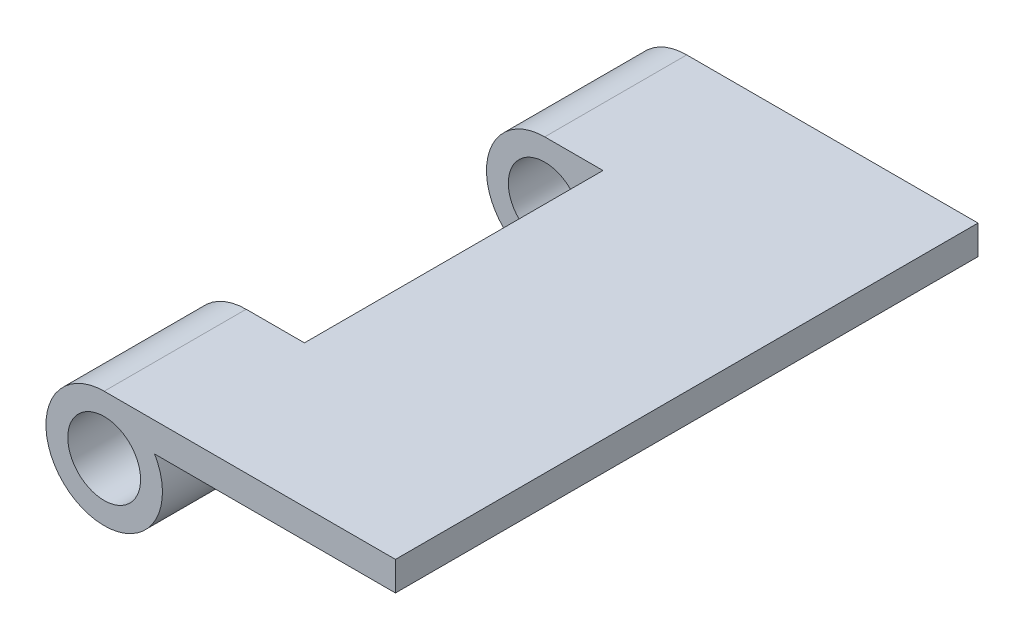
ISO-10303-21;
HEADER;
FILE_DESCRIPTION(('STEP AP214'),'2;1');
FILE_NAME('part.step','',(''),(''),'','','');
FILE_SCHEMA(('AUTOMOTIVE_DESIGN { 1 0 10303 214 1 1 1 1 }'));
ENDSEC;
DATA;
#1=APPLICATION_CONTEXT('core data for automotive mechanical design processes');
#2=APPLICATION_PROTOCOL_DEFINITION('international standard','automotive_design',2000,#1);
#3=PRODUCT_CONTEXT('',#1,'mechanical');
#4=PRODUCT('Part','Part','',(#3));
#5=PRODUCT_RELATED_PRODUCT_CATEGORY('part','',(#4));
#6=PRODUCT_DEFINITION_FORMATION('','',#4);
#7=PRODUCT_DEFINITION_CONTEXT('part definition',#1,'design');
#8=PRODUCT_DEFINITION('design','',#6,#7);
#9=PRODUCT_DEFINITION_SHAPE('','',#8);
#10=(LENGTH_UNIT() NAMED_UNIT(*) SI_UNIT(.MILLI.,.METRE.));
#11=(NAMED_UNIT(*) PLANE_ANGLE_UNIT() SI_UNIT($,.RADIAN.));
#12=(NAMED_UNIT(*) SI_UNIT($,.STERADIAN.) SOLID_ANGLE_UNIT());
#13=UNCERTAINTY_MEASURE_WITH_UNIT(LENGTH_MEASURE(1.E-05),#10,'distance_accuracy_value','');
#14=(GEOMETRIC_REPRESENTATION_CONTEXT(3) GLOBAL_UNCERTAINTY_ASSIGNED_CONTEXT((#13)) GLOBAL_UNIT_ASSIGNED_CONTEXT((#10,
#11,#12)) REPRESENTATION_CONTEXT('',''));
#15=CARTESIAN_POINT('',(0.,0.,0.));
#16=DIRECTION('',(0.,0.,1.));
#17=DIRECTION('',(1.,0.,0.));
#18=AXIS2_PLACEMENT_3D('',#15,#16,#17);
#19=CARTESIAN_POINT('',(20.,4.,20.));
#20=DIRECTION('',(1.,0.,0.));
#21=DIRECTION('',(0.,1.,0.));
#22=AXIS2_PLACEMENT_3D('',#19,#20,#21);
#23=PLANE('',#22);
#24=DIRECTION('',(0.,-1.,0.));
#25=VECTOR('',#24,1.);
#26=CARTESIAN_POINT('',(20.,4.,20.));
#27=LINE('',#26,#25);
#28=CARTESIAN_POINT('',(20.,4.,20.));
#29=VERTEX_POINT('',#28);
#30=CARTESIAN_POINT('',(20.,2.,20.));
#31=VERTEX_POINT('',#30);
#32=EDGE_CURVE('E20',#29,#31,#27,.T.);
#33=ORIENTED_EDGE('',*,*,#32,.T.);
#34=DIRECTION('',(0.,0.,-1.));
#35=VECTOR('',#34,1.);
#36=CARTESIAN_POINT('',(20.,2.,20.));
#37=LINE('',#36,#35);
#38=CARTESIAN_POINT('',(20.,2.,-20.));
#39=VERTEX_POINT('',#38);
#40=EDGE_CURVE('E163',#31,#39,#37,.T.);
#41=ORIENTED_EDGE('',*,*,#40,.T.);
#42=DIRECTION('',(0.,-1.,0.));
#43=VECTOR('',#42,1.);
#44=CARTESIAN_POINT('',(20.,4.,-20.));
#45=LINE('',#44,#43);
#46=CARTESIAN_POINT('',(20.,4.,-20.));
#47=VERTEX_POINT('',#46);
#48=EDGE_CURVE('E11',#47,#39,#45,.T.);
#49=ORIENTED_EDGE('',*,*,#48,.F.);
#50=DIRECTION('',(0.,0.,-1.));
#51=VECTOR('',#50,1.);
#52=CARTESIAN_POINT('',(20.,4.,20.));
#53=LINE('',#52,#51);
#54=EDGE_CURVE('E75',#29,#47,#53,.T.);
#55=ORIENTED_EDGE('',*,*,#54,.F.);
#56=EDGE_LOOP('',(#33,#41,#49,#55));
#57=FACE_BOUND('',#56,.T.);
#58=ADVANCED_FACE('F16',(#57),#23,.T.);
#59=CARTESIAN_POINT('',(0.,0.,-20.));
#60=DIRECTION('',(0.,0.,-1.));
#61=DIRECTION('',(0.,-1.,0.));
#62=AXIS2_PLACEMENT_3D('',#59,#60,#61);
#63=PLANE('',#62);
#64=CARTESIAN_POINT('',(0.,0.,-20.));
#65=DIRECTION('',(0.,0.,1.));
#66=DIRECTION('',(1.,0.,0.));
#67=AXIS2_PLACEMENT_3D('',#64,#65,#66);
#68=CIRCLE('',#67,2.5);
#69=CARTESIAN_POINT('',(2.5,0.,-20.));
#70=VERTEX_POINT('',#69);
#71=EDGE_CURVE('E135',#70,#70,#68,.T.);
#72=ORIENTED_EDGE('',*,*,#71,.T.);
#73=EDGE_LOOP('',(#72));
#74=FACE_BOUND('',#73,.T.);
#75=DIRECTION('',(1.,0.,0.));
#76=VECTOR('',#75,1.);
#77=CARTESIAN_POINT('',(0.,4.,-20.));
#78=LINE('',#77,#76);
#79=CARTESIAN_POINT('',(0.,4.,-20.));
#80=VERTEX_POINT('',#79);
#81=EDGE_CURVE('E157',#80,#47,#78,.T.);
#82=ORIENTED_EDGE('',*,*,#81,.T.);
#83=ORIENTED_EDGE('',*,*,#48,.T.);
#84=DIRECTION('',(-1.,0.,0.));
#85=VECTOR('',#84,1.);
#86=CARTESIAN_POINT('',(20.,2.,-20.));
#87=LINE('',#86,#85);
#88=CARTESIAN_POINT('',(3.464101615138,2.,-20.));
#89=VERTEX_POINT('',#88);
#90=EDGE_CURVE('E167',#39,#89,#87,.T.);
#91=ORIENTED_EDGE('',*,*,#90,.T.);
#92=CARTESIAN_POINT('',(0.,0.,-20.));
#93=DIRECTION('',(0.,0.,-1.));
#94=DIRECTION('',(0.866025403784429,0.500000000000017,0.));
#95=AXIS2_PLACEMENT_3D('',#92,#93,#94);
#96=CIRCLE('',#95,4.);
#97=EDGE_CURVE('E27',#89,#80,#96,.T.);
#98=ORIENTED_EDGE('',*,*,#97,.T.);
#99=EDGE_LOOP('',(#82,#83,#91,#98));
#100=FACE_BOUND('',#99,.T.);
#101=ADVANCED_FACE('F228',(#74,#100),#63,.T.);
#102=CARTESIAN_POINT('',(0.,0.,20.));
#103=DIRECTION('',(0.,0.,-1.));
#104=DIRECTION('',(1.,0.,0.));
#105=AXIS2_PLACEMENT_3D('',#102,#103,#104);
#106=CYLINDRICAL_SURFACE('',#105,4.);
#107=CARTESIAN_POINT('',(0.,0.,-10.25));
#108=DIRECTION('',(0.,0.,1.));
#109=DIRECTION('',(0.,1.,0.));
#110=AXIS2_PLACEMENT_3D('',#107,#108,#109);
#111=CIRCLE('',#110,4.);
#112=CARTESIAN_POINT('',(0.,4.,-10.25));
#113=VERTEX_POINT('',#112);
#114=CARTESIAN_POINT('',(3.464101615138,2.,-10.25));
#115=VERTEX_POINT('',#114);
#116=EDGE_CURVE('E171',#113,#115,#111,.T.);
#117=ORIENTED_EDGE('',*,*,#116,.F.);
#118=DIRECTION('',(0.,0.,-1.));
#119=VECTOR('',#118,1.);
#120=CARTESIAN_POINT('',(0.,4.,-10.25));
#121=LINE('',#120,#119);
#122=EDGE_CURVE('E152',#113,#80,#121,.T.);
#123=ORIENTED_EDGE('',*,*,#122,.T.);
#124=ORIENTED_EDGE('',*,*,#97,.F.);
#125=DIRECTION('',(0.,0.,-1.));
#126=VECTOR('',#125,1.);
#127=CARTESIAN_POINT('',(3.464101615138,2.,-10.25));
#128=LINE('',#127,#126);
#129=EDGE_CURVE('E172',#115,#89,#128,.T.);
#130=ORIENTED_EDGE('',*,*,#129,.F.);
#131=EDGE_LOOP('',(#117,#123,#124,#130));
#132=FACE_BOUND('',#131,.T.);
#133=ADVANCED_FACE('F237',(#132),#106,.T.);
#134=CARTESIAN_POINT('',(0.,0.,20.));
#135=DIRECTION('',(0.,0.,-1.));
#136=DIRECTION('',(1.,0.,0.));
#137=AXIS2_PLACEMENT_3D('',#134,#135,#136);
#138=CYLINDRICAL_SURFACE('',#137,4.);
#139=CARTESIAN_POINT('',(0.,0.,10.25));
#140=DIRECTION('',(0.,0.,-1.));
#141=DIRECTION('',(0.866025403784429,0.500000000000017,0.));
#142=AXIS2_PLACEMENT_3D('',#139,#140,#141);
#143=CIRCLE('',#142,4.);
#144=CARTESIAN_POINT('',(3.464101615138,2.,10.25));
#145=VERTEX_POINT('',#144);
#146=CARTESIAN_POINT('',(0.,4.,10.25));
#147=VERTEX_POINT('',#146);
#148=EDGE_CURVE('E187',#145,#147,#143,.T.);
#149=ORIENTED_EDGE('',*,*,#148,.F.);
#150=DIRECTION('',(0.,0.,-1.));
#151=VECTOR('',#150,1.);
#152=CARTESIAN_POINT('',(3.464101615138,2.,20.));
#153=LINE('',#152,#151);
#154=CARTESIAN_POINT('',(3.464101615138,2.,20.));
#155=VERTEX_POINT('',#154);
#156=EDGE_CURVE('E166',#155,#145,#153,.T.);
#157=ORIENTED_EDGE('',*,*,#156,.F.);
#158=CARTESIAN_POINT('',(0.,0.,20.));
#159=DIRECTION('',(0.,0.,-1.));
#160=DIRECTION('',(0.866025403784429,0.500000000000017,0.));
#161=AXIS2_PLACEMENT_3D('',#158,#159,#160);
#162=CIRCLE('',#161,4.);
#163=CARTESIAN_POINT('',(0.,4.,20.));
#164=VERTEX_POINT('',#163);
#165=EDGE_CURVE('E180',#155,#164,#162,.T.);
#166=ORIENTED_EDGE('',*,*,#165,.T.);
#167=DIRECTION('',(0.,0.,-1.));
#168=VECTOR('',#167,1.);
#169=CARTESIAN_POINT('',(0.,4.,20.));
#170=LINE('',#169,#168);
#171=EDGE_CURVE('E63',#164,#147,#170,.T.);
#172=ORIENTED_EDGE('',*,*,#171,.T.);
#173=EDGE_LOOP('',(#149,#157,#166,#172));
#174=FACE_BOUND('',#173,.T.);
#175=ADVANCED_FACE('F249',(#174),#138,.T.);
#176=CARTESIAN_POINT('',(20.,2.,20.));
#177=DIRECTION('',(0.,-1.,0.));
#178=DIRECTION('',(-1.,0.,0.));
#179=AXIS2_PLACEMENT_3D('',#176,#177,#178);
#180=PLANE('',#179);
#181=DIRECTION('',(1.,0.,0.));
#182=VECTOR('',#181,1.);
#183=CARTESIAN_POINT('',(3.464101615138,2.,10.25));
#184=LINE('',#183,#182);
#185=CARTESIAN_POINT('',(4.,2.,10.25));
#186=VERTEX_POINT('',#185);
#187=EDGE_CURVE('E206',#145,#186,#184,.T.);
#188=ORIENTED_EDGE('',*,*,#187,.T.);
#189=DIRECTION('',(0.,0.,-1.));
#190=VECTOR('',#189,1.);
#191=CARTESIAN_POINT('',(4.,2.,10.25));
#192=LINE('',#191,#190);
#193=CARTESIAN_POINT('',(4.,2.,-10.25));
#194=VERTEX_POINT('',#193);
#195=EDGE_CURVE('E176',#186,#194,#192,.T.);
#196=ORIENTED_EDGE('',*,*,#195,.T.);
#197=DIRECTION('',(1.,0.,0.));
#198=VECTOR('',#197,1.);
#199=CARTESIAN_POINT('',(3.464101615138,2.,-10.25));
#200=LINE('',#199,#198);
#201=EDGE_CURVE('E162',#115,#194,#200,.T.);
#202=ORIENTED_EDGE('',*,*,#201,.F.);
#203=ORIENTED_EDGE('',*,*,#129,.T.);
#204=ORIENTED_EDGE('',*,*,#90,.F.);
#205=ORIENTED_EDGE('',*,*,#40,.F.);
#206=DIRECTION('',(-1.,0.,0.));
#207=VECTOR('',#206,1.);
#208=CARTESIAN_POINT('',(20.,2.,20.));
#209=LINE('',#208,#207);
#210=EDGE_CURVE('E189',#31,#155,#209,.T.);
#211=ORIENTED_EDGE('',*,*,#210,.T.);
#212=ORIENTED_EDGE('',*,*,#156,.T.);
#213=EDGE_LOOP('',(#188,#196,#202,#203,#204,#205,#211,#212));
#214=FACE_BOUND('',#213,.T.);
#215=ADVANCED_FACE('F233',(#214),#180,.T.);
#216=CARTESIAN_POINT('',(4.,4.,10.25));
#217=DIRECTION('',(1.,0.,0.));
#218=DIRECTION('',(0.,1.,0.));
#219=AXIS2_PLACEMENT_3D('',#216,#217,#218);
#220=PLANE('',#219);
#221=DIRECTION('',(0.,0.,-1.));
#222=VECTOR('',#221,1.);
#223=CARTESIAN_POINT('',(4.,4.,10.25));
#224=LINE('',#223,#222);
#225=CARTESIAN_POINT('',(4.,4.,10.25));
#226=VERTEX_POINT('',#225);
#227=CARTESIAN_POINT('',(4.,4.,-10.25));
#228=VERTEX_POINT('',#227);
#229=EDGE_CURVE('E156',#226,#228,#224,.T.);
#230=ORIENTED_EDGE('',*,*,#229,.T.);
#231=DIRECTION('',(0.,-1.,0.));
#232=VECTOR('',#231,1.);
#233=CARTESIAN_POINT('',(4.,4.,-10.25));
#234=LINE('',#233,#232);
#235=EDGE_CURVE('E158',#228,#194,#234,.T.);
#236=ORIENTED_EDGE('',*,*,#235,.T.);
#237=ORIENTED_EDGE('',*,*,#195,.F.);
#238=DIRECTION('',(0.,-1.,0.));
#239=VECTOR('',#238,1.);
#240=CARTESIAN_POINT('',(4.,4.,10.25));
#241=LINE('',#240,#239);
#242=EDGE_CURVE('E149',#226,#186,#241,.T.);
#243=ORIENTED_EDGE('',*,*,#242,.F.);
#244=EDGE_LOOP('',(#230,#236,#237,#243));
#245=FACE_BOUND('',#244,.T.);
#246=ADVANCED_FACE('F242',(#245),#220,.F.);
#247=CARTESIAN_POINT('',(0.,4.,20.));
#248=DIRECTION('',(0.,1.,0.));
#249=DIRECTION('',(0.,0.,-1.));
#250=AXIS2_PLACEMENT_3D('',#247,#248,#249);
#251=PLANE('',#250);
#252=DIRECTION('',(1.,0.,0.));
#253=VECTOR('',#252,1.);
#254=CARTESIAN_POINT('',(0.,4.,10.25));
#255=LINE('',#254,#253);
#256=EDGE_CURVE('E141',#147,#226,#255,.T.);
#257=ORIENTED_EDGE('',*,*,#256,.F.);
#258=ORIENTED_EDGE('',*,*,#171,.F.);
#259=DIRECTION('',(1.,0.,0.));
#260=VECTOR('',#259,1.);
#261=CARTESIAN_POINT('',(0.,4.,20.));
#262=LINE('',#261,#260);
#263=EDGE_CURVE('E177',#164,#29,#262,.T.);
#264=ORIENTED_EDGE('',*,*,#263,.T.);
#265=ORIENTED_EDGE('',*,*,#54,.T.);
#266=ORIENTED_EDGE('',*,*,#81,.F.);
#267=ORIENTED_EDGE('',*,*,#122,.F.);
#268=DIRECTION('',(1.,0.,0.));
#269=VECTOR('',#268,1.);
#270=CARTESIAN_POINT('',(0.,4.,-10.25));
#271=LINE('',#270,#269);
#272=EDGE_CURVE('E183',#113,#228,#271,.T.);
#273=ORIENTED_EDGE('',*,*,#272,.T.);
#274=ORIENTED_EDGE('',*,*,#229,.F.);
#275=EDGE_LOOP('',(#257,#258,#264,#265,#266,#267,#273,#274));
#276=FACE_BOUND('',#275,.T.);
#277=ADVANCED_FACE('F229',(#276),#251,.T.);
#278=CARTESIAN_POINT('',(4.,4.,-10.25));
#279=DIRECTION('',(0.,0.,-1.));
#280=DIRECTION('',(0.,-1.,0.));
#281=AXIS2_PLACEMENT_3D('',#278,#279,#280);
#282=PLANE('',#281);
#283=CARTESIAN_POINT('',(0.,0.,-10.25));
#284=DIRECTION('',(0.,0.,-1.));
#285=DIRECTION('',(-1.,0.,0.));
#286=AXIS2_PLACEMENT_3D('',#283,#284,#285);
#287=CIRCLE('',#286,2.5);
#288=CARTESIAN_POINT('',(2.5,0.,-10.25));
#289=VERTEX_POINT('',#288);
#290=EDGE_CURVE('E130',#289,#289,#287,.T.);
#291=ORIENTED_EDGE('',*,*,#290,.T.);
#292=EDGE_LOOP('',(#291));
#293=FACE_BOUND('',#292,.T.);
#294=ORIENTED_EDGE('',*,*,#272,.F.);
#295=ORIENTED_EDGE('',*,*,#116,.T.);
#296=ORIENTED_EDGE('',*,*,#201,.T.);
#297=ORIENTED_EDGE('',*,*,#235,.F.);
#298=EDGE_LOOP('',(#294,#295,#296,#297));
#299=FACE_BOUND('',#298,.T.);
#300=ADVANCED_FACE('F131',(#293,#299),#282,.F.);
#301=CARTESIAN_POINT('',(-4.,4.,10.25));
#302=DIRECTION('',(0.,0.,1.));
#303=DIRECTION('',(0.,-1.,0.));
#304=AXIS2_PLACEMENT_3D('',#301,#302,#303);
#305=PLANE('',#304);
#306=CARTESIAN_POINT('',(0.,0.,10.25));
#307=DIRECTION('',(0.,0.,-1.));
#308=DIRECTION('',(-1.,0.,0.));
#309=AXIS2_PLACEMENT_3D('',#306,#307,#308);
#310=CIRCLE('',#309,2.5);
#311=CARTESIAN_POINT('',(-2.5,0.,10.25));
#312=VERTEX_POINT('',#311);
#313=EDGE_CURVE('E125',#312,#312,#310,.T.);
#314=ORIENTED_EDGE('',*,*,#313,.F.);
#315=EDGE_LOOP('',(#314));
#316=FACE_BOUND('',#315,.T.);
#317=ORIENTED_EDGE('',*,*,#256,.T.);
#318=ORIENTED_EDGE('',*,*,#242,.T.);
#319=ORIENTED_EDGE('',*,*,#187,.F.);
#320=ORIENTED_EDGE('',*,*,#148,.T.);
#321=EDGE_LOOP('',(#317,#318,#319,#320));
#322=FACE_BOUND('',#321,.T.);
#323=ADVANCED_FACE('F245',(#316,#322),#305,.F.);
#324=CARTESIAN_POINT('',(0.,0.,20.));
#325=DIRECTION('',(0.,0.,-1.));
#326=DIRECTION('',(1.,0.,0.));
#327=AXIS2_PLACEMENT_3D('',#324,#325,#326);
#328=CYLINDRICAL_SURFACE('',#327,2.5);
#329=ORIENTED_EDGE('',*,*,#71,.F.);
#330=EDGE_LOOP('',(#329));
#331=FACE_BOUND('',#330,.T.);
#332=ORIENTED_EDGE('',*,*,#290,.F.);
#333=EDGE_LOOP('',(#332));
#334=FACE_BOUND('',#333,.T.);
#335=ADVANCED_FACE('F273',(#331,#334),#328,.F.);
#336=CARTESIAN_POINT('',(0.,0.,20.));
#337=DIRECTION('',(0.,0.,-1.));
#338=DIRECTION('',(1.,0.,0.));
#339=AXIS2_PLACEMENT_3D('',#336,#337,#338);
#340=CYLINDRICAL_SURFACE('',#339,2.5);
#341=CARTESIAN_POINT('',(0.,0.,20.));
#342=DIRECTION('',(0.,0.,1.));
#343=DIRECTION('',(1.,0.,0.));
#344=AXIS2_PLACEMENT_3D('',#341,#342,#343);
#345=CIRCLE('',#344,2.5);
#346=CARTESIAN_POINT('',(-2.5,0.,20.));
#347=VERTEX_POINT('',#346);
#348=EDGE_CURVE('E143',#347,#347,#345,.T.);
#349=ORIENTED_EDGE('',*,*,#348,.T.);
#350=EDGE_LOOP('',(#349));
#351=FACE_BOUND('',#350,.T.);
#352=ORIENTED_EDGE('',*,*,#313,.T.);
#353=EDGE_LOOP('',(#352));
#354=FACE_BOUND('',#353,.T.);
#355=ADVANCED_FACE('F18',(#351,#354),#340,.F.);
#356=CARTESIAN_POINT('',(0.,0.,20.));
#357=DIRECTION('',(0.,0.,-1.));
#358=DIRECTION('',(0.,-1.,0.));
#359=AXIS2_PLACEMENT_3D('',#356,#357,#358);
#360=PLANE('',#359);
#361=ORIENTED_EDGE('',*,*,#348,.F.);
#362=EDGE_LOOP('',(#361));
#363=FACE_BOUND('',#362,.T.);
#364=ORIENTED_EDGE('',*,*,#263,.F.);
#365=ORIENTED_EDGE('',*,*,#165,.F.);
#366=ORIENTED_EDGE('',*,*,#210,.F.);
#367=ORIENTED_EDGE('',*,*,#32,.F.);
#368=EDGE_LOOP('',(#364,#365,#366,#367));
#369=FACE_BOUND('',#368,.T.);
#370=ADVANCED_FACE('F231',(#363,#369),#360,.F.);
#371=CLOSED_SHELL('',(#58,#101,#133,#175,#215,#246,#277,#300,#323,#335,#355,#370));
#372=MANIFOLD_SOLID_BREP('B1',#371);
#373=ADVANCED_BREP_SHAPE_REPRESENTATION('',(#18,#372),#14);
#374=SHAPE_DEFINITION_REPRESENTATION(#9,#373);
ENDSEC;
END-ISO-10303-21;
